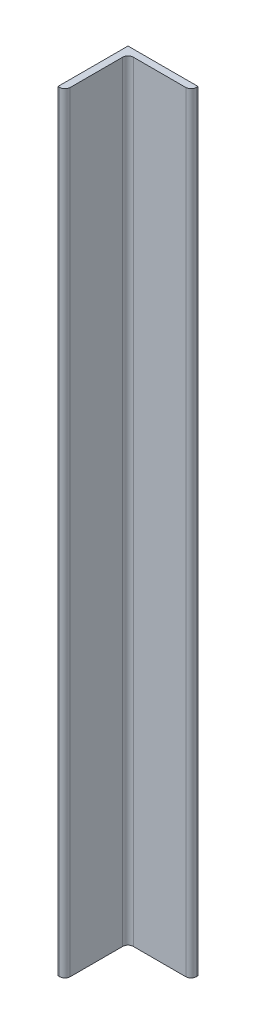
ISO-10303-21;
HEADER;
FILE_DESCRIPTION(('STEP AP214'),'2;1');
FILE_NAME('part.step','',(''),(''),'','','');
FILE_SCHEMA(('AUTOMOTIVE_DESIGN { 1 0 10303 214 1 1 1 1 }'));
ENDSEC;
DATA;
#1=APPLICATION_CONTEXT('core data for automotive mechanical design processes');
#2=APPLICATION_PROTOCOL_DEFINITION('international standard','automotive_design',2000,#1);
#3=PRODUCT_CONTEXT('',#1,'mechanical');
#4=PRODUCT('Part','Part','',(#3));
#5=PRODUCT_RELATED_PRODUCT_CATEGORY('part','',(#4));
#6=PRODUCT_DEFINITION_FORMATION('','',#4);
#7=PRODUCT_DEFINITION_CONTEXT('part definition',#1,'design');
#8=PRODUCT_DEFINITION('design','',#6,#7);
#9=PRODUCT_DEFINITION_SHAPE('','',#8);
#10=(LENGTH_UNIT() NAMED_UNIT(*) SI_UNIT(.MILLI.,.METRE.));
#11=(NAMED_UNIT(*) PLANE_ANGLE_UNIT() SI_UNIT($,.RADIAN.));
#12=(NAMED_UNIT(*) SI_UNIT($,.STERADIAN.) SOLID_ANGLE_UNIT());
#13=UNCERTAINTY_MEASURE_WITH_UNIT(LENGTH_MEASURE(1.E-05),#10,'distance_accuracy_value','');
#14=(GEOMETRIC_REPRESENTATION_CONTEXT(3) GLOBAL_UNCERTAINTY_ASSIGNED_CONTEXT((#13)) GLOBAL_UNIT_ASSIGNED_CONTEXT((#10,
#11,#12)) REPRESENTATION_CONTEXT('',''));
#15=CARTESIAN_POINT('',(0.,0.,0.));
#16=DIRECTION('',(0.,0.,1.));
#17=DIRECTION('',(1.,0.,0.));
#18=AXIS2_PLACEMENT_3D('',#15,#16,#17);
#19=CARTESIAN_POINT('',(-27.4998721449582,440.,-28.2131532770167));
#20=DIRECTION('',(-1.,0.,0.));
#21=DIRECTION('',(0.,0.,1.));
#22=AXIS2_PLACEMENT_3D('',#19,#20,#21);
#23=PLANE('',#22);
#24=DIRECTION('',(0.,0.,-1.));
#25=VECTOR('',#24,1.);
#26=CARTESIAN_POINT('',(-27.4998721449582,0.,-28.2131532770167));
#27=LINE('',#26,#25);
#28=CARTESIAN_POINT('',(-27.4998721449582,0.,-28.2131532770167));
#29=VERTEX_POINT('',#28);
#30=CARTESIAN_POINT('',(-27.4998721449565,0.,-29.2131532770166));
#31=VERTEX_POINT('',#30);
#32=EDGE_CURVE('E146',#29,#31,#27,.T.);
#33=ORIENTED_EDGE('',*,*,#32,.T.);
#34=DIRECTION('',(0.,-1.,0.));
#35=VECTOR('',#34,1.);
#36=CARTESIAN_POINT('',(-27.4998721449565,440.,-29.2131532770166));
#37=LINE('',#36,#35);
#38=CARTESIAN_POINT('',(-27.4998721449565,440.,-29.2131532770166));
#39=VERTEX_POINT('',#38);
#40=EDGE_CURVE('E13',#39,#31,#37,.T.);
#41=ORIENTED_EDGE('',*,*,#40,.F.);
#42=DIRECTION('',(0.,0.,-1.));
#43=VECTOR('',#42,1.);
#44=CARTESIAN_POINT('',(-27.4998721449582,440.,-28.2131532770167));
#45=LINE('',#44,#43);
#46=CARTESIAN_POINT('',(-27.4998721449582,440.,-28.2131532770167));
#47=VERTEX_POINT('',#46);
#48=EDGE_CURVE('E162',#47,#39,#45,.T.);
#49=ORIENTED_EDGE('',*,*,#48,.F.);
#50=DIRECTION('',(0.,-1.,0.));
#51=VECTOR('',#50,1.);
#52=CARTESIAN_POINT('',(-27.4998721449582,440.,-28.2131532770167));
#53=LINE('',#52,#51);
#54=EDGE_CURVE('E142',#47,#29,#53,.T.);
#55=ORIENTED_EDGE('',*,*,#54,.T.);
#56=EDGE_LOOP('',(#33,#41,#49,#55));
#57=FACE_BOUND('',#56,.T.);
#58=ADVANCED_FACE('F44',(#57),#23,.F.);
#59=CARTESIAN_POINT('',(-27.4998721449565,440.,-29.2131532770166));
#60=DIRECTION('',(0.,0.,1.));
#61=DIRECTION('',(1.,0.,0.));
#62=AXIS2_PLACEMENT_3D('',#59,#60,#61);
#63=PLANE('',#62);
#64=DIRECTION('',(-1.,0.,0.));
#65=VECTOR('',#64,1.);
#66=CARTESIAN_POINT('',(-27.4998721449565,0.,-29.2131532770166));
#67=LINE('',#66,#65);
#68=CARTESIAN_POINT('',(-67.4998721449566,0.,-29.2131532770166));
#69=VERTEX_POINT('',#68);
#70=EDGE_CURVE('E149',#31,#69,#67,.T.);
#71=ORIENTED_EDGE('',*,*,#70,.T.);
#72=DIRECTION('',(0.,-1.,0.));
#73=VECTOR('',#72,1.);
#74=CARTESIAN_POINT('',(-67.4998721449566,440.,-29.2131532770166));
#75=LINE('',#74,#73);
#76=CARTESIAN_POINT('',(-67.4998721449566,440.,-29.2131532770166));
#77=VERTEX_POINT('',#76);
#78=EDGE_CURVE('E52',#77,#69,#75,.T.);
#79=ORIENTED_EDGE('',*,*,#78,.F.);
#80=DIRECTION('',(-1.,0.,0.));
#81=VECTOR('',#80,1.);
#82=CARTESIAN_POINT('',(-27.4998721449565,440.,-29.2131532770166));
#83=LINE('',#82,#81);
#84=EDGE_CURVE('E106',#39,#77,#83,.T.);
#85=ORIENTED_EDGE('',*,*,#84,.F.);
#86=ORIENTED_EDGE('',*,*,#40,.T.);
#87=EDGE_LOOP('',(#71,#79,#85,#86));
#88=FACE_BOUND('',#87,.T.);
#89=ADVANCED_FACE('F205',(#88),#63,.F.);
#90=CARTESIAN_POINT('',(-67.4998721449566,440.,-29.2131532770166));
#91=DIRECTION('',(1.,0.,0.));
#92=DIRECTION('',(0.,0.,-1.));
#93=AXIS2_PLACEMENT_3D('',#90,#91,#92);
#94=PLANE('',#93);
#95=DIRECTION('',(0.,0.,1.));
#96=VECTOR('',#95,1.);
#97=CARTESIAN_POINT('',(-67.4998721449566,0.,-29.2131532770166));
#98=LINE('',#97,#96);
#99=CARTESIAN_POINT('',(-67.4998721449582,0.,10.7868467229835));
#100=VERTEX_POINT('',#99);
#101=EDGE_CURVE('E151',#69,#100,#98,.T.);
#102=ORIENTED_EDGE('',*,*,#101,.T.);
#103=DIRECTION('',(0.,-1.,0.));
#104=VECTOR('',#103,1.);
#105=CARTESIAN_POINT('',(-67.4998721449582,440.,10.7868467229835));
#106=LINE('',#105,#104);
#107=CARTESIAN_POINT('',(-67.4998721449582,440.,10.7868467229835));
#108=VERTEX_POINT('',#107);
#109=EDGE_CURVE('E172',#108,#100,#106,.T.);
#110=ORIENTED_EDGE('',*,*,#109,.F.);
#111=DIRECTION('',(0.,0.,1.));
#112=VECTOR('',#111,1.);
#113=CARTESIAN_POINT('',(-67.4998721449566,440.,-29.2131532770166));
#114=LINE('',#113,#112);
#115=EDGE_CURVE('E180',#77,#108,#114,.T.);
#116=ORIENTED_EDGE('',*,*,#115,.F.);
#117=ORIENTED_EDGE('',*,*,#78,.T.);
#118=EDGE_LOOP('',(#102,#110,#116,#117));
#119=FACE_BOUND('',#118,.T.);
#120=ADVANCED_FACE('F178',(#119),#94,.F.);
#121=CARTESIAN_POINT('',(-67.4998721449582,440.,10.7868467229835));
#122=DIRECTION('',(0.,0.,-1.));
#123=DIRECTION('',(-1.,0.,0.));
#124=AXIS2_PLACEMENT_3D('',#121,#122,#123);
#125=PLANE('',#124);
#126=DIRECTION('',(1.,0.,0.));
#127=VECTOR('',#126,1.);
#128=CARTESIAN_POINT('',(-67.4998721449582,0.,10.7868467229835));
#129=LINE('',#128,#127);
#130=CARTESIAN_POINT('',(-66.4998721449582,0.,10.7868467229835));
#131=VERTEX_POINT('',#130);
#132=EDGE_CURVE('E153',#100,#131,#129,.T.);
#133=ORIENTED_EDGE('',*,*,#132,.T.);
#134=DIRECTION('',(0.,-1.,0.));
#135=VECTOR('',#134,1.);
#136=CARTESIAN_POINT('',(-66.4998721449582,440.,10.7868467229835));
#137=LINE('',#136,#135);
#138=CARTESIAN_POINT('',(-66.4998721449582,440.,10.7868467229835));
#139=VERTEX_POINT('',#138);
#140=EDGE_CURVE('E169',#139,#131,#137,.T.);
#141=ORIENTED_EDGE('',*,*,#140,.F.);
#142=DIRECTION('',(1.,0.,0.));
#143=VECTOR('',#142,1.);
#144=CARTESIAN_POINT('',(-67.4998721449582,440.,10.7868467229835));
#145=LINE('',#144,#143);
#146=EDGE_CURVE('E196',#108,#139,#145,.T.);
#147=ORIENTED_EDGE('',*,*,#146,.F.);
#148=ORIENTED_EDGE('',*,*,#109,.T.);
#149=EDGE_LOOP('',(#133,#141,#147,#148));
#150=FACE_BOUND('',#149,.T.);
#151=ADVANCED_FACE('F189',(#150),#125,.F.);
#152=CARTESIAN_POINT('',(-66.4998721449582,440.,7.78684672298335));
#153=DIRECTION('',(0.,-1.,0.));
#154=DIRECTION('',(0.,0.,-1.));
#155=AXIS2_PLACEMENT_3D('',#152,#153,#154);
#156=CYLINDRICAL_SURFACE('',#155,3.);
#157=CARTESIAN_POINT('',(-66.4998721449582,0.,7.78684672298335));
#158=DIRECTION('',(0.,1.,0.));
#159=DIRECTION('',(0.,0.,1.));
#160=AXIS2_PLACEMENT_3D('',#157,#158,#159);
#161=CIRCLE('',#160,3.);
#162=CARTESIAN_POINT('',(-63.4998721449582,0.,7.78684672298335));
#163=VERTEX_POINT('',#162);
#164=EDGE_CURVE('E155',#131,#163,#161,.T.);
#165=ORIENTED_EDGE('',*,*,#164,.T.);
#166=DIRECTION('',(0.,-1.,0.));
#167=VECTOR('',#166,1.);
#168=CARTESIAN_POINT('',(-63.4998721449582,440.,7.78684672298335));
#169=LINE('',#168,#167);
#170=CARTESIAN_POINT('',(-63.4998721449582,440.,7.78684672298335));
#171=VERTEX_POINT('',#170);
#172=EDGE_CURVE('E166',#171,#163,#169,.T.);
#173=ORIENTED_EDGE('',*,*,#172,.F.);
#174=CARTESIAN_POINT('',(-66.4998721449582,440.,7.78684672298335));
#175=DIRECTION('',(0.,1.,0.));
#176=DIRECTION('',(0.,0.,1.));
#177=AXIS2_PLACEMENT_3D('',#174,#175,#176);
#178=CIRCLE('',#177,3.);
#179=EDGE_CURVE('E195',#139,#171,#178,.T.);
#180=ORIENTED_EDGE('',*,*,#179,.F.);
#181=ORIENTED_EDGE('',*,*,#140,.T.);
#182=EDGE_LOOP('',(#165,#173,#180,#181));
#183=FACE_BOUND('',#182,.T.);
#184=ADVANCED_FACE('F193',(#183),#156,.T.);
#185=CARTESIAN_POINT('',(-63.4998721449582,440.,7.78684672298335));
#186=DIRECTION('',(-1.,0.,0.));
#187=DIRECTION('',(0.,0.,1.));
#188=AXIS2_PLACEMENT_3D('',#185,#186,#187);
#189=PLANE('',#188);
#190=DIRECTION('',(0.,0.,-1.));
#191=VECTOR('',#190,1.);
#192=CARTESIAN_POINT('',(-63.4998721449582,0.,7.78684672298335));
#193=LINE('',#192,#191);
#194=CARTESIAN_POINT('',(-63.4998721449582,0.,-22.2131532770167));
#195=VERTEX_POINT('',#194);
#196=EDGE_CURVE('E157',#163,#195,#193,.T.);
#197=ORIENTED_EDGE('',*,*,#196,.T.);
#198=DIRECTION('',(0.,-1.,0.));
#199=VECTOR('',#198,1.);
#200=CARTESIAN_POINT('',(-63.4998721449582,440.,-22.2131532770167));
#201=LINE('',#200,#199);
#202=CARTESIAN_POINT('',(-63.4998721449582,440.,-22.2131532770167));
#203=VERTEX_POINT('',#202);
#204=EDGE_CURVE('E137',#203,#195,#201,.T.);
#205=ORIENTED_EDGE('',*,*,#204,.F.);
#206=DIRECTION('',(0.,0.,-1.));
#207=VECTOR('',#206,1.);
#208=CARTESIAN_POINT('',(-63.4998721449582,440.,7.78684672298335));
#209=LINE('',#208,#207);
#210=EDGE_CURVE('E128',#171,#203,#209,.T.);
#211=ORIENTED_EDGE('',*,*,#210,.F.);
#212=ORIENTED_EDGE('',*,*,#172,.T.);
#213=EDGE_LOOP('',(#197,#205,#211,#212));
#214=FACE_BOUND('',#213,.T.);
#215=ADVANCED_FACE('F217',(#214),#189,.F.);
#216=CARTESIAN_POINT('',(-60.4998721449582,440.,-22.2131532770167));
#217=DIRECTION('',(0.,-1.,0.));
#218=DIRECTION('',(0.,0.,-1.));
#219=AXIS2_PLACEMENT_3D('',#216,#217,#218);
#220=CYLINDRICAL_SURFACE('',#219,3.);
#221=CARTESIAN_POINT('',(-60.4998721449582,0.,-22.2131532770167));
#222=DIRECTION('',(0.,-1.,0.));
#223=DIRECTION('',(0.,0.,-1.));
#224=AXIS2_PLACEMENT_3D('',#221,#222,#223);
#225=CIRCLE('',#224,3.);
#226=CARTESIAN_POINT('',(-60.4998721449582,0.,-25.2131532770166));
#227=VERTEX_POINT('',#226);
#228=EDGE_CURVE('E136',#195,#227,#225,.T.);
#229=ORIENTED_EDGE('',*,*,#228,.T.);
#230=DIRECTION('',(0.,-1.,0.));
#231=VECTOR('',#230,1.);
#232=CARTESIAN_POINT('',(-60.4998721449582,440.,-25.2131532770166));
#233=LINE('',#232,#231);
#234=CARTESIAN_POINT('',(-60.4998721449582,440.,-25.2131532770166));
#235=VERTEX_POINT('',#234);
#236=EDGE_CURVE('E133',#235,#227,#233,.T.);
#237=ORIENTED_EDGE('',*,*,#236,.F.);
#238=CARTESIAN_POINT('',(-60.4998721449582,440.,-22.2131532770167));
#239=DIRECTION('',(0.,-1.,0.));
#240=DIRECTION('',(0.,0.,-1.));
#241=AXIS2_PLACEMENT_3D('',#238,#239,#240);
#242=CIRCLE('',#241,3.);
#243=EDGE_CURVE('E122',#203,#235,#242,.T.);
#244=ORIENTED_EDGE('',*,*,#243,.F.);
#245=ORIENTED_EDGE('',*,*,#204,.T.);
#246=EDGE_LOOP('',(#229,#237,#244,#245));
#247=FACE_BOUND('',#246,.T.);
#248=ADVANCED_FACE('F134',(#247),#220,.F.);
#249=CARTESIAN_POINT('',(-60.4998721449582,440.,-25.2131532770166));
#250=DIRECTION('',(0.,0.,-1.));
#251=DIRECTION('',(-1.,0.,0.));
#252=AXIS2_PLACEMENT_3D('',#249,#250,#251);
#253=PLANE('',#252);
#254=DIRECTION('',(1.,0.,0.));
#255=VECTOR('',#254,1.);
#256=CARTESIAN_POINT('',(-60.4998721449582,0.,-25.2131532770166));
#257=LINE('',#256,#255);
#258=CARTESIAN_POINT('',(-30.4998721449582,0.,-25.2131532770166));
#259=VERTEX_POINT('',#258);
#260=EDGE_CURVE('E92',#227,#259,#257,.T.);
#261=ORIENTED_EDGE('',*,*,#260,.T.);
#262=DIRECTION('',(0.,-1.,0.));
#263=VECTOR('',#262,1.);
#264=CARTESIAN_POINT('',(-30.4998721449582,440.,-25.2131532770166));
#265=LINE('',#264,#263);
#266=CARTESIAN_POINT('',(-30.4998721449582,440.,-25.2131532770166));
#267=VERTEX_POINT('',#266);
#268=EDGE_CURVE('E138',#267,#259,#265,.T.);
#269=ORIENTED_EDGE('',*,*,#268,.F.);
#270=DIRECTION('',(1.,0.,0.));
#271=VECTOR('',#270,1.);
#272=CARTESIAN_POINT('',(-60.4998721449582,440.,-25.2131532770166));
#273=LINE('',#272,#271);
#274=EDGE_CURVE('E126',#235,#267,#273,.T.);
#275=ORIENTED_EDGE('',*,*,#274,.F.);
#276=ORIENTED_EDGE('',*,*,#236,.T.);
#277=EDGE_LOOP('',(#261,#269,#275,#276));
#278=FACE_BOUND('',#277,.T.);
#279=ADVANCED_FACE('F140',(#278),#253,.F.);
#280=CARTESIAN_POINT('',(-30.4998721449582,440.,-28.2131532770167));
#281=DIRECTION('',(0.,-1.,0.));
#282=DIRECTION('',(0.,0.,-1.));
#283=AXIS2_PLACEMENT_3D('',#280,#281,#282);
#284=CYLINDRICAL_SURFACE('',#283,3.);
#285=CARTESIAN_POINT('',(-30.4998721449582,0.,-28.2131532770167));
#286=DIRECTION('',(0.,1.,0.));
#287=DIRECTION('',(0.,0.,1.));
#288=AXIS2_PLACEMENT_3D('',#285,#286,#287);
#289=CIRCLE('',#288,3.);
#290=EDGE_CURVE('E98',#259,#29,#289,.T.);
#291=ORIENTED_EDGE('',*,*,#290,.T.);
#292=ORIENTED_EDGE('',*,*,#54,.F.);
#293=CARTESIAN_POINT('',(-30.4998721449582,440.,-28.2131532770167));
#294=DIRECTION('',(0.,1.,0.));
#295=DIRECTION('',(0.,0.,1.));
#296=AXIS2_PLACEMENT_3D('',#293,#294,#295);
#297=CIRCLE('',#296,3.);
#298=EDGE_CURVE('E60',#267,#47,#297,.T.);
#299=ORIENTED_EDGE('',*,*,#298,.F.);
#300=ORIENTED_EDGE('',*,*,#268,.T.);
#301=EDGE_LOOP('',(#291,#292,#299,#300));
#302=FACE_BOUND('',#301,.T.);
#303=ADVANCED_FACE('F225',(#302),#284,.T.);
#304=CARTESIAN_POINT('',(-66.4998721449582,440.,7.78684672298335));
#305=DIRECTION('',(0.,1.,0.));
#306=DIRECTION('',(0.,0.,1.));
#307=AXIS2_PLACEMENT_3D('',#304,#305,#306);
#308=PLANE('',#307);
#309=ORIENTED_EDGE('',*,*,#48,.T.);
#310=ORIENTED_EDGE('',*,*,#84,.T.);
#311=ORIENTED_EDGE('',*,*,#115,.T.);
#312=ORIENTED_EDGE('',*,*,#146,.T.);
#313=ORIENTED_EDGE('',*,*,#179,.T.);
#314=ORIENTED_EDGE('',*,*,#210,.T.);
#315=ORIENTED_EDGE('',*,*,#243,.T.);
#316=ORIENTED_EDGE('',*,*,#274,.T.);
#317=ORIENTED_EDGE('',*,*,#298,.T.);
#318=EDGE_LOOP('',(#309,#310,#311,#312,#313,#314,#315,#316,#317));
#319=FACE_BOUND('',#318,.T.);
#320=ADVANCED_FACE('F124',(#319),#308,.T.);
#321=CARTESIAN_POINT('',(-66.4998721449582,0.,7.78684672298335));
#322=DIRECTION('',(0.,1.,0.));
#323=DIRECTION('',(0.,0.,1.));
#324=AXIS2_PLACEMENT_3D('',#321,#322,#323);
#325=PLANE('',#324);
#326=ORIENTED_EDGE('',*,*,#32,.F.);
#327=ORIENTED_EDGE('',*,*,#290,.F.);
#328=ORIENTED_EDGE('',*,*,#260,.F.);
#329=ORIENTED_EDGE('',*,*,#228,.F.);
#330=ORIENTED_EDGE('',*,*,#196,.F.);
#331=ORIENTED_EDGE('',*,*,#164,.F.);
#332=ORIENTED_EDGE('',*,*,#132,.F.);
#333=ORIENTED_EDGE('',*,*,#101,.F.);
#334=ORIENTED_EDGE('',*,*,#70,.F.);
#335=EDGE_LOOP('',(#326,#327,#328,#329,#330,#331,#332,#333,#334));
#336=FACE_BOUND('',#335,.T.);
#337=ADVANCED_FACE('F184',(#336),#325,.F.);
#338=CLOSED_SHELL('',(#58,#89,#120,#151,#184,#215,#248,#279,#303,#320,#337));
#339=MANIFOLD_SOLID_BREP('B2',#338);
#340=ADVANCED_BREP_SHAPE_REPRESENTATION('',(#18,#339),#14);
#341=SHAPE_DEFINITION_REPRESENTATION(#9,#340);
ENDSEC;
END-ISO-10303-21;
